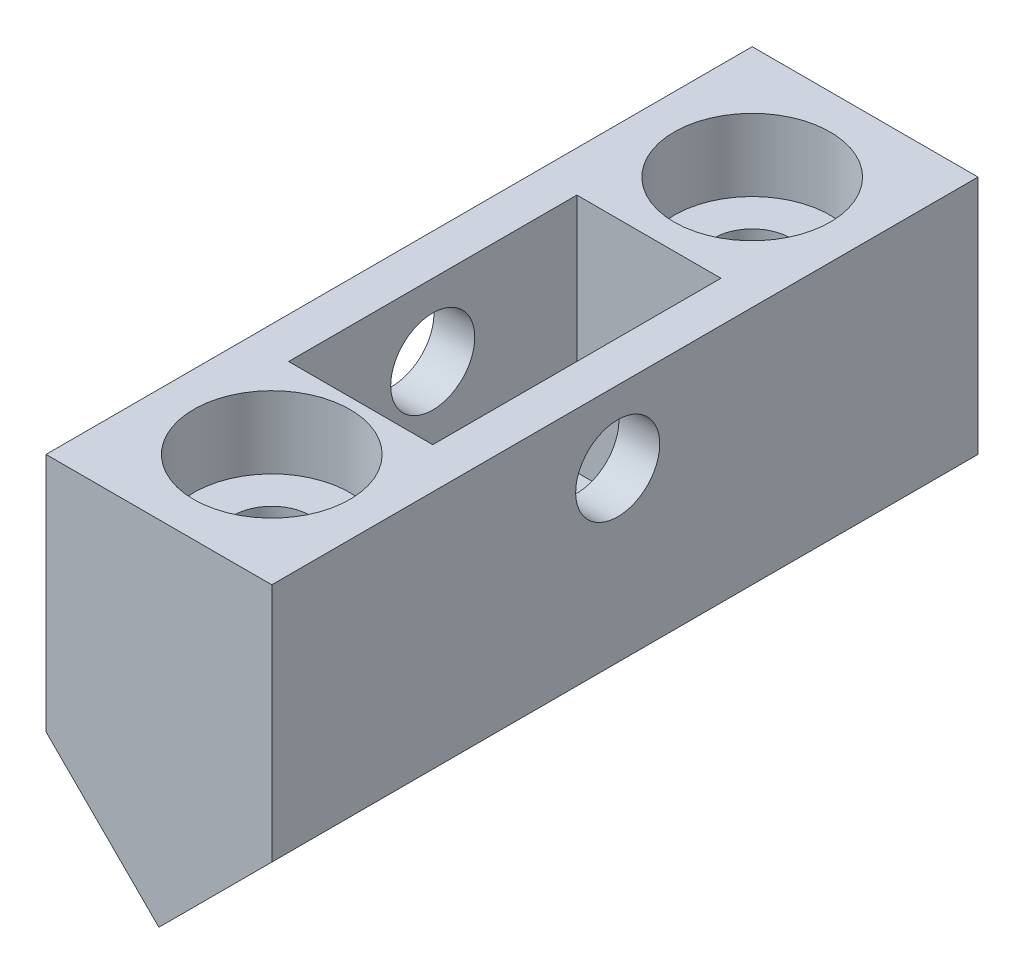
ISO-10303-21;
HEADER;
FILE_DESCRIPTION(('STEP AP214'),'2;1');
FILE_NAME('part.step','',(''),(''),'','','');
FILE_SCHEMA(('AUTOMOTIVE_DESIGN { 1 0 10303 214 1 1 1 1 }'));
ENDSEC;
DATA;
#1=APPLICATION_CONTEXT('core data for automotive mechanical design processes');
#2=APPLICATION_PROTOCOL_DEFINITION('international standard','automotive_design',2000,#1);
#3=PRODUCT_CONTEXT('',#1,'mechanical');
#4=PRODUCT('Part','Part','',(#3));
#5=PRODUCT_RELATED_PRODUCT_CATEGORY('part','',(#4));
#6=PRODUCT_DEFINITION_FORMATION('','',#4);
#7=PRODUCT_DEFINITION_CONTEXT('part definition',#1,'design');
#8=PRODUCT_DEFINITION('design','',#6,#7);
#9=PRODUCT_DEFINITION_SHAPE('','',#8);
#10=(LENGTH_UNIT() NAMED_UNIT(*) SI_UNIT(.MILLI.,.METRE.));
#11=(NAMED_UNIT(*) PLANE_ANGLE_UNIT() SI_UNIT($,.RADIAN.));
#12=(NAMED_UNIT(*) SI_UNIT($,.STERADIAN.) SOLID_ANGLE_UNIT());
#13=UNCERTAINTY_MEASURE_WITH_UNIT(LENGTH_MEASURE(1.E-05),#10,'distance_accuracy_value','');
#14=(GEOMETRIC_REPRESENTATION_CONTEXT(3) GLOBAL_UNCERTAINTY_ASSIGNED_CONTEXT((#13)) GLOBAL_UNIT_ASSIGNED_CONTEXT((#10,
#11,#12)) REPRESENTATION_CONTEXT('',''));
#15=CARTESIAN_POINT('',(0.,0.,0.));
#16=DIRECTION('',(0.,0.,1.));
#17=DIRECTION('',(1.,0.,0.));
#18=AXIS2_PLACEMENT_3D('',#15,#16,#17);
#19=CARTESIAN_POINT('',(0.,-9.70000000000001,-15.));
#20=DIRECTION('',(0.707106781186549,-0.707106781186546,0.));
#21=DIRECTION('',(0.707106781186546,0.707106781186549,0.));
#22=AXIS2_PLACEMENT_3D('',#19,#20,#21);
#23=PLANE('',#22);
#24=CARTESIAN_POINT('',(0.,-9.70000000000001,9.7));
#25=DIRECTION('',(0.707106781186549,-0.707106781186546,0.));
#26=DIRECTION('',(0.707106781186546,0.707106781186549,0.));
#27=AXIS2_PLACEMENT_3D('',#24,#25,#26);
#28=ELLIPSE('',#27,2.26274169979695,1.6);
#29=CARTESIAN_POINT('',(0.,-9.70000000000001,8.1));
#30=VERTEX_POINT('',#29);
#31=CARTESIAN_POINT('',(0.,-9.70000000000001,11.3));
#32=VERTEX_POINT('',#31);
#33=EDGE_CURVE('E45',#30,#32,#28,.T.);
#34=ORIENTED_EDGE('',*,*,#33,.F.);
#35=DIRECTION('',(0.,0.,1.));
#36=VECTOR('',#35,1.);
#37=CARTESIAN_POINT('',(0.,-9.70000000000001,-15.));
#38=LINE('',#37,#36);
#39=CARTESIAN_POINT('',(0.,-9.70000000000001,-8.7));
#40=VERTEX_POINT('',#39);
#41=EDGE_CURVE('E118',#40,#30,#38,.T.);
#42=ORIENTED_EDGE('',*,*,#41,.F.);
#43=CARTESIAN_POINT('',(0.,-9.70000000000001,-10.3));
#44=DIRECTION('',(0.707106781186549,-0.707106781186546,0.));
#45=DIRECTION('',(0.707106781186546,0.707106781186549,0.));
#46=AXIS2_PLACEMENT_3D('',#43,#44,#45);
#47=ELLIPSE('',#46,2.26274169979695,1.6);
#48=CARTESIAN_POINT('',(0.,-9.70000000000001,-11.9));
#49=VERTEX_POINT('',#48);
#50=EDGE_CURVE('E40',#49,#40,#47,.T.);
#51=ORIENTED_EDGE('',*,*,#50,.F.);
#52=CARTESIAN_POINT('',(0.,-9.70000000000001,-15.));
#53=VERTEX_POINT('',#52);
#54=EDGE_CURVE('E126',#53,#49,#38,.T.);
#55=ORIENTED_EDGE('',*,*,#54,.F.);
#56=DIRECTION('',(0.707106781186546,0.707106781186549,0.));
#57=VECTOR('',#56,1.);
#58=CARTESIAN_POINT('',(0.,-9.70000000000001,-15.));
#59=LINE('',#58,#57);
#60=CARTESIAN_POINT('',(4.7,-5.,-15.));
#61=VERTEX_POINT('',#60);
#62=EDGE_CURVE('E163',#53,#61,#59,.T.);
#63=ORIENTED_EDGE('',*,*,#62,.T.);
#64=DIRECTION('',(0.,0.,1.));
#65=VECTOR('',#64,1.);
#66=CARTESIAN_POINT('',(4.7,-5.,-15.));
#67=LINE('',#66,#65);
#68=CARTESIAN_POINT('',(4.7,-5.,14.4));
#69=VERTEX_POINT('',#68);
#70=EDGE_CURVE('E138',#61,#69,#67,.T.);
#71=ORIENTED_EDGE('',*,*,#70,.T.);
#72=DIRECTION('',(0.707106781186546,0.707106781186549,0.));
#73=VECTOR('',#72,1.);
#74=CARTESIAN_POINT('',(0.,-9.70000000000001,14.4));
#75=LINE('',#74,#73);
#76=CARTESIAN_POINT('',(0.,-9.70000000000001,14.4));
#77=VERTEX_POINT('',#76);
#78=EDGE_CURVE('E177',#77,#69,#75,.T.);
#79=ORIENTED_EDGE('',*,*,#78,.F.);
#80=EDGE_CURVE('E120',#32,#77,#38,.T.);
#81=ORIENTED_EDGE('',*,*,#80,.F.);
#82=EDGE_LOOP('',(#34,#42,#51,#55,#63,#71,#79,#81));
#83=FACE_BOUND('',#82,.T.);
#84=ADVANCED_FACE('F33',(#83),#23,.T.);
#85=CARTESIAN_POINT('',(-4.7,-5.,-15.));
#86=DIRECTION('',(-0.707106781186548,-0.707106781186547,0.));
#87=DIRECTION('',(0.707106781186547,-0.707106781186548,0.));
#88=AXIS2_PLACEMENT_3D('',#85,#86,#87);
#89=PLANE('',#88);
#90=CARTESIAN_POINT('',(0.,-9.70000000000001,9.7));
#91=DIRECTION('',(-0.707106781186548,-0.707106781186547,0.));
#92=DIRECTION('',(-0.707106781186547,0.707106781186548,0.));
#93=AXIS2_PLACEMENT_3D('',#90,#91,#92);
#94=ELLIPSE('',#93,2.26274169979695,1.6);
#95=EDGE_CURVE('E11',#32,#30,#94,.T.);
#96=ORIENTED_EDGE('',*,*,#95,.F.);
#97=ORIENTED_EDGE('',*,*,#80,.T.);
#98=DIRECTION('',(0.707106781186547,-0.707106781186548,0.));
#99=VECTOR('',#98,1.);
#100=CARTESIAN_POINT('',(-4.7,-5.,14.4));
#101=LINE('',#100,#99);
#102=CARTESIAN_POINT('',(-4.7,-5.,14.4));
#103=VERTEX_POINT('',#102);
#104=EDGE_CURVE('E165',#103,#77,#101,.T.);
#105=ORIENTED_EDGE('',*,*,#104,.F.);
#106=DIRECTION('',(0.,0.,1.));
#107=VECTOR('',#106,1.);
#108=CARTESIAN_POINT('',(-4.7,-5.,-15.));
#109=LINE('',#108,#107);
#110=CARTESIAN_POINT('',(-4.7,-5.,-15.));
#111=VERTEX_POINT('',#110);
#112=EDGE_CURVE('E128',#111,#103,#109,.T.);
#113=ORIENTED_EDGE('',*,*,#112,.F.);
#114=DIRECTION('',(0.707106781186547,-0.707106781186548,0.));
#115=VECTOR('',#114,1.);
#116=CARTESIAN_POINT('',(-4.7,-5.,-15.));
#117=LINE('',#116,#115);
#118=EDGE_CURVE('E131',#111,#53,#117,.T.);
#119=ORIENTED_EDGE('',*,*,#118,.T.);
#120=ORIENTED_EDGE('',*,*,#54,.T.);
#121=CARTESIAN_POINT('',(0.,-9.70000000000001,-10.3));
#122=DIRECTION('',(-0.707106781186548,-0.707106781186547,0.));
#123=DIRECTION('',(-0.707106781186547,0.707106781186548,0.));
#124=AXIS2_PLACEMENT_3D('',#121,#122,#123);
#125=ELLIPSE('',#124,2.26274169979695,1.6);
#126=EDGE_CURVE('E52',#40,#49,#125,.T.);
#127=ORIENTED_EDGE('',*,*,#126,.F.);
#128=ORIENTED_EDGE('',*,*,#41,.T.);
#129=EDGE_LOOP('',(#96,#97,#105,#113,#119,#120,#127,#128));
#130=FACE_BOUND('',#129,.T.);
#131=ADVANCED_FACE('F124',(#130),#89,.T.);
#132=CARTESIAN_POINT('',(-4.7,5.,-15.));
#133=DIRECTION('',(-1.,0.,0.));
#134=DIRECTION('',(0.,0.,1.));
#135=AXIS2_PLACEMENT_3D('',#132,#133,#134);
#136=PLANE('',#135);
#137=CARTESIAN_POINT('',(-4.7,2.,0.));
#138=DIRECTION('',(1.,0.,0.));
#139=DIRECTION('',(0.,1.,0.));
#140=AXIS2_PLACEMENT_3D('',#137,#138,#139);
#141=CIRCLE('',#140,1.75);
#142=CARTESIAN_POINT('',(-4.7,3.75,0.));
#143=VERTEX_POINT('',#142);
#144=EDGE_CURVE('E143',#143,#143,#141,.T.);
#145=ORIENTED_EDGE('',*,*,#144,.T.);
#146=EDGE_LOOP('',(#145));
#147=FACE_BOUND('',#146,.T.);
#148=ORIENTED_EDGE('',*,*,#112,.T.);
#149=DIRECTION('',(0.,-1.,0.));
#150=VECTOR('',#149,1.);
#151=CARTESIAN_POINT('',(-4.7,5.,14.4));
#152=LINE('',#151,#150);
#153=CARTESIAN_POINT('',(-4.7,5.,14.4));
#154=VERTEX_POINT('',#153);
#155=EDGE_CURVE('E168',#154,#103,#152,.T.);
#156=ORIENTED_EDGE('',*,*,#155,.F.);
#157=DIRECTION('',(0.,0.,1.));
#158=VECTOR('',#157,1.);
#159=CARTESIAN_POINT('',(-4.7,5.,-15.));
#160=LINE('',#159,#158);
#161=CARTESIAN_POINT('',(-4.7,5.,-15.));
#162=VERTEX_POINT('',#161);
#163=EDGE_CURVE('E134',#162,#154,#160,.T.);
#164=ORIENTED_EDGE('',*,*,#163,.F.);
#165=DIRECTION('',(0.,-1.,0.));
#166=VECTOR('',#165,1.);
#167=CARTESIAN_POINT('',(-4.7,5.,-15.));
#168=LINE('',#167,#166);
#169=EDGE_CURVE('E154',#162,#111,#168,.T.);
#170=ORIENTED_EDGE('',*,*,#169,.T.);
#171=EDGE_LOOP('',(#148,#156,#164,#170));
#172=FACE_BOUND('',#171,.T.);
#173=ADVANCED_FACE('F243',(#147,#172),#136,.T.);
#174=CARTESIAN_POINT('',(-4.7,5.,-15.));
#175=DIRECTION('',(0.,1.,0.));
#176=DIRECTION('',(0.,0.,1.));
#177=AXIS2_PLACEMENT_3D('',#174,#175,#176);
#178=PLANE('',#177);
#179=CARTESIAN_POINT('',(0.,5.,9.7));
#180=DIRECTION('',(0.,1.,0.));
#181=DIRECTION('',(0.,0.,1.));
#182=AXIS2_PLACEMENT_3D('',#179,#180,#181);
#183=CIRCLE('',#182,3.25);
#184=CARTESIAN_POINT('',(0.,5.,12.95));
#185=VERTEX_POINT('',#184);
#186=EDGE_CURVE('E233',#185,#185,#183,.T.);
#187=ORIENTED_EDGE('',*,*,#186,.F.);
#188=EDGE_LOOP('',(#187));
#189=FACE_BOUND('',#188,.T.);
#190=CARTESIAN_POINT('',(0.,5.,-10.3));
#191=DIRECTION('',(0.,1.,0.));
#192=DIRECTION('',(0.,0.,1.));
#193=AXIS2_PLACEMENT_3D('',#190,#191,#192);
#194=CIRCLE('',#193,3.25);
#195=CARTESIAN_POINT('',(0.,5.,-7.05));
#196=VERTEX_POINT('',#195);
#197=EDGE_CURVE('E121',#196,#196,#194,.T.);
#198=ORIENTED_EDGE('',*,*,#197,.F.);
#199=EDGE_LOOP('',(#198));
#200=FACE_BOUND('',#199,.T.);
#201=DIRECTION('',(0.,0.,-1.));
#202=VECTOR('',#201,1.);
#203=CARTESIAN_POINT('',(3.,5.,-6.));
#204=LINE('',#203,#202);
#205=CARTESIAN_POINT('',(3.,5.,6.));
#206=VERTEX_POINT('',#205);
#207=CARTESIAN_POINT('',(3.00000000000001,5.,-6.));
#208=VERTEX_POINT('',#207);
#209=EDGE_CURVE('E200',#206,#208,#204,.T.);
#210=ORIENTED_EDGE('',*,*,#209,.F.);
#211=DIRECTION('',(1.,0.,0.));
#212=VECTOR('',#211,1.);
#213=CARTESIAN_POINT('',(-3.,5.,6.));
#214=LINE('',#213,#212);
#215=CARTESIAN_POINT('',(-3.,5.,6.));
#216=VERTEX_POINT('',#215);
#217=EDGE_CURVE('E190',#216,#206,#214,.T.);
#218=ORIENTED_EDGE('',*,*,#217,.F.);
#219=DIRECTION('',(0.,0.,1.));
#220=VECTOR('',#219,1.);
#221=CARTESIAN_POINT('',(-3.,5.,-6.));
#222=LINE('',#221,#220);
#223=CARTESIAN_POINT('',(-3.,5.,-6.));
#224=VERTEX_POINT('',#223);
#225=EDGE_CURVE('E194',#224,#216,#222,.T.);
#226=ORIENTED_EDGE('',*,*,#225,.F.);
#227=DIRECTION('',(-1.,0.,0.));
#228=VECTOR('',#227,1.);
#229=CARTESIAN_POINT('',(-3.,5.,-6.));
#230=LINE('',#229,#228);
#231=EDGE_CURVE('E197',#208,#224,#230,.T.);
#232=ORIENTED_EDGE('',*,*,#231,.F.);
#233=EDGE_LOOP('',(#210,#218,#226,#232));
#234=FACE_BOUND('',#233,.T.);
#235=ORIENTED_EDGE('',*,*,#163,.T.);
#236=DIRECTION('',(-1.,0.,0.));
#237=VECTOR('',#236,1.);
#238=CARTESIAN_POINT('',(-4.7,5.,14.4));
#239=LINE('',#238,#237);
#240=CARTESIAN_POINT('',(4.7,5.,14.4));
#241=VERTEX_POINT('',#240);
#242=EDGE_CURVE('E171',#241,#154,#239,.T.);
#243=ORIENTED_EDGE('',*,*,#242,.F.);
#244=DIRECTION('',(0.,0.,1.));
#245=VECTOR('',#244,1.);
#246=CARTESIAN_POINT('',(4.7,5.,-15.));
#247=LINE('',#246,#245);
#248=CARTESIAN_POINT('',(4.7,5.,-15.));
#249=VERTEX_POINT('',#248);
#250=EDGE_CURVE('E136',#249,#241,#247,.T.);
#251=ORIENTED_EDGE('',*,*,#250,.F.);
#252=DIRECTION('',(-1.,0.,0.));
#253=VECTOR('',#252,1.);
#254=CARTESIAN_POINT('',(-4.7,5.,-15.));
#255=LINE('',#254,#253);
#256=EDGE_CURVE('E155',#249,#162,#255,.T.);
#257=ORIENTED_EDGE('',*,*,#256,.T.);
#258=EDGE_LOOP('',(#235,#243,#251,#257));
#259=FACE_BOUND('',#258,.T.);
#260=ADVANCED_FACE('F239',(#189,#200,#234,#259),#178,.T.);
#261=CARTESIAN_POINT('',(4.7,5.,-15.));
#262=DIRECTION('',(1.,0.,0.));
#263=DIRECTION('',(0.,1.,0.));
#264=AXIS2_PLACEMENT_3D('',#261,#262,#263);
#265=PLANE('',#264);
#266=CARTESIAN_POINT('',(4.7,2.,0.));
#267=DIRECTION('',(1.,0.,0.));
#268=DIRECTION('',(0.,1.,0.));
#269=AXIS2_PLACEMENT_3D('',#266,#267,#268);
#270=CIRCLE('',#269,1.75);
#271=CARTESIAN_POINT('',(4.7,3.75,0.));
#272=VERTEX_POINT('',#271);
#273=EDGE_CURVE('E214',#272,#272,#270,.T.);
#274=ORIENTED_EDGE('',*,*,#273,.F.);
#275=EDGE_LOOP('',(#274));
#276=FACE_BOUND('',#275,.T.);
#277=ORIENTED_EDGE('',*,*,#250,.T.);
#278=DIRECTION('',(0.,1.,0.));
#279=VECTOR('',#278,1.);
#280=CARTESIAN_POINT('',(4.7,5.,14.4));
#281=LINE('',#280,#279);
#282=EDGE_CURVE('E174',#69,#241,#281,.T.);
#283=ORIENTED_EDGE('',*,*,#282,.F.);
#284=ORIENTED_EDGE('',*,*,#70,.F.);
#285=DIRECTION('',(0.,1.,0.));
#286=VECTOR('',#285,1.);
#287=CARTESIAN_POINT('',(4.7,5.,-15.));
#288=LINE('',#287,#286);
#289=EDGE_CURVE('E158',#61,#249,#288,.T.);
#290=ORIENTED_EDGE('',*,*,#289,.T.);
#291=EDGE_LOOP('',(#277,#283,#284,#290));
#292=FACE_BOUND('',#291,.T.);
#293=ADVANCED_FACE('F242',(#276,#292),#265,.T.);
#294=CARTESIAN_POINT('',(0.,0.,-15.));
#295=DIRECTION('',(0.,0.,-1.));
#296=DIRECTION('',(-1.,0.,0.));
#297=AXIS2_PLACEMENT_3D('',#294,#295,#296);
#298=PLANE('',#297);
#299=ORIENTED_EDGE('',*,*,#62,.F.);
#300=ORIENTED_EDGE('',*,*,#118,.F.);
#301=ORIENTED_EDGE('',*,*,#169,.F.);
#302=ORIENTED_EDGE('',*,*,#256,.F.);
#303=ORIENTED_EDGE('',*,*,#289,.F.);
#304=EDGE_LOOP('',(#299,#300,#301,#302,#303));
#305=FACE_BOUND('',#304,.T.);
#306=ADVANCED_FACE('F370',(#305),#298,.T.);
#307=CARTESIAN_POINT('',(0.,0.,14.4));
#308=DIRECTION('',(0.,0.,-1.));
#309=DIRECTION('',(-1.,0.,0.));
#310=AXIS2_PLACEMENT_3D('',#307,#308,#309);
#311=PLANE('',#310);
#312=ORIENTED_EDGE('',*,*,#78,.T.);
#313=ORIENTED_EDGE('',*,*,#282,.T.);
#314=ORIENTED_EDGE('',*,*,#242,.T.);
#315=ORIENTED_EDGE('',*,*,#155,.T.);
#316=ORIENTED_EDGE('',*,*,#104,.T.);
#317=EDGE_LOOP('',(#312,#313,#314,#315,#316));
#318=FACE_BOUND('',#317,.T.);
#319=ADVANCED_FACE('F255',(#318),#311,.F.);
#320=CARTESIAN_POINT('',(3.00000000000001,-5.,-6.));
#321=DIRECTION('',(1.,0.,0.));
#322=DIRECTION('',(0.,1.,0.));
#323=AXIS2_PLACEMENT_3D('',#320,#321,#322);
#324=PLANE('',#323);
#325=CARTESIAN_POINT('',(3.,2.,0.));
#326=DIRECTION('',(1.,0.,0.));
#327=DIRECTION('',(0.,1.,0.));
#328=AXIS2_PLACEMENT_3D('',#325,#326,#327);
#329=CIRCLE('',#328,1.75);
#330=CARTESIAN_POINT('',(3.,3.75,0.));
#331=VERTEX_POINT('',#330);
#332=EDGE_CURVE('E142',#331,#331,#329,.T.);
#333=ORIENTED_EDGE('',*,*,#332,.T.);
#334=EDGE_LOOP('',(#333));
#335=FACE_BOUND('',#334,.T.);
#336=ORIENTED_EDGE('',*,*,#209,.T.);
#337=DIRECTION('',(0.,1.,0.));
#338=VECTOR('',#337,1.);
#339=CARTESIAN_POINT('',(3.00000000000001,-5.,-6.));
#340=LINE('',#339,#338);
#341=CARTESIAN_POINT('',(3.00000000000001,-5.,-6.));
#342=VERTEX_POINT('',#341);
#343=EDGE_CURVE('E181',#342,#208,#340,.T.);
#344=ORIENTED_EDGE('',*,*,#343,.F.);
#345=DIRECTION('',(0.,0.,-1.));
#346=VECTOR('',#345,1.);
#347=CARTESIAN_POINT('',(3.00000000000001,-5.,-6.));
#348=LINE('',#347,#346);
#349=CARTESIAN_POINT('',(3.00000000000001,-5.,6.));
#350=VERTEX_POINT('',#349);
#351=EDGE_CURVE('E193',#350,#342,#348,.T.);
#352=ORIENTED_EDGE('',*,*,#351,.F.);
#353=DIRECTION('',(0.,1.,0.));
#354=VECTOR('',#353,1.);
#355=CARTESIAN_POINT('',(3.00000000000001,-5.,6.));
#356=LINE('',#355,#354);
#357=EDGE_CURVE('E180',#350,#206,#356,.T.);
#358=ORIENTED_EDGE('',*,*,#357,.T.);
#359=EDGE_LOOP('',(#336,#344,#352,#358));
#360=FACE_BOUND('',#359,.T.);
#361=ADVANCED_FACE('F357',(#335,#360),#324,.F.);
#362=CARTESIAN_POINT('',(-2.99999999999999,-5.,6.));
#363=DIRECTION('',(0.,0.,1.));
#364=DIRECTION('',(1.,0.,0.));
#365=AXIS2_PLACEMENT_3D('',#362,#363,#364);
#366=PLANE('',#365);
#367=ORIENTED_EDGE('',*,*,#217,.T.);
#368=ORIENTED_EDGE('',*,*,#357,.F.);
#369=DIRECTION('',(1.,0.,0.));
#370=VECTOR('',#369,1.);
#371=CARTESIAN_POINT('',(-2.99999999999999,-5.,6.));
#372=LINE('',#371,#370);
#373=CARTESIAN_POINT('',(-2.99999999999999,-5.,6.));
#374=VERTEX_POINT('',#373);
#375=EDGE_CURVE('E185',#374,#350,#372,.T.);
#376=ORIENTED_EDGE('',*,*,#375,.F.);
#377=DIRECTION('',(0.,1.,0.));
#378=VECTOR('',#377,1.);
#379=CARTESIAN_POINT('',(-2.99999999999999,-5.,6.));
#380=LINE('',#379,#378);
#381=EDGE_CURVE('E187',#374,#216,#380,.T.);
#382=ORIENTED_EDGE('',*,*,#381,.T.);
#383=EDGE_LOOP('',(#367,#368,#376,#382));
#384=FACE_BOUND('',#383,.T.);
#385=ADVANCED_FACE('F353',(#384),#366,.F.);
#386=CARTESIAN_POINT('',(-2.99999999999999,-5.,-6.));
#387=DIRECTION('',(-1.,0.,0.));
#388=DIRECTION('',(0.,-1.,0.));
#389=AXIS2_PLACEMENT_3D('',#386,#387,#388);
#390=PLANE('',#389);
#391=CARTESIAN_POINT('',(-3.,2.,0.));
#392=DIRECTION('',(-1.,0.,0.));
#393=DIRECTION('',(0.,-1.,0.));
#394=AXIS2_PLACEMENT_3D('',#391,#392,#393);
#395=CIRCLE('',#394,1.75);
#396=CARTESIAN_POINT('',(-3.,0.250000000000002,0.));
#397=VERTEX_POINT('',#396);
#398=EDGE_CURVE('E140',#397,#397,#395,.T.);
#399=ORIENTED_EDGE('',*,*,#398,.T.);
#400=EDGE_LOOP('',(#399));
#401=FACE_BOUND('',#400,.T.);
#402=ORIENTED_EDGE('',*,*,#225,.T.);
#403=ORIENTED_EDGE('',*,*,#381,.F.);
#404=DIRECTION('',(0.,0.,1.));
#405=VECTOR('',#404,1.);
#406=CARTESIAN_POINT('',(-2.99999999999999,-5.,-6.));
#407=LINE('',#406,#405);
#408=CARTESIAN_POINT('',(-2.99999999999999,-5.,-6.));
#409=VERTEX_POINT('',#408);
#410=EDGE_CURVE('E204',#409,#374,#407,.T.);
#411=ORIENTED_EDGE('',*,*,#410,.F.);
#412=DIRECTION('',(0.,1.,0.));
#413=VECTOR('',#412,1.);
#414=CARTESIAN_POINT('',(-2.99999999999999,-5.,-6.));
#415=LINE('',#414,#413);
#416=EDGE_CURVE('E184',#409,#224,#415,.T.);
#417=ORIENTED_EDGE('',*,*,#416,.T.);
#418=EDGE_LOOP('',(#402,#403,#411,#417));
#419=FACE_BOUND('',#418,.T.);
#420=ADVANCED_FACE('F356',(#401,#419),#390,.F.);
#421=CARTESIAN_POINT('',(-2.99999999999999,-5.,-6.));
#422=DIRECTION('',(0.,0.,-1.));
#423=DIRECTION('',(-1.,0.,0.));
#424=AXIS2_PLACEMENT_3D('',#421,#422,#423);
#425=PLANE('',#424);
#426=ORIENTED_EDGE('',*,*,#231,.T.);
#427=ORIENTED_EDGE('',*,*,#416,.F.);
#428=DIRECTION('',(-1.,0.,0.));
#429=VECTOR('',#428,1.);
#430=CARTESIAN_POINT('',(-2.99999999999999,-5.,-6.));
#431=LINE('',#430,#429);
#432=EDGE_CURVE('E207',#342,#409,#431,.T.);
#433=ORIENTED_EDGE('',*,*,#432,.F.);
#434=ORIENTED_EDGE('',*,*,#343,.T.);
#435=EDGE_LOOP('',(#426,#427,#433,#434));
#436=FACE_BOUND('',#435,.T.);
#437=ADVANCED_FACE('F351',(#436),#425,.F.);
#438=CARTESIAN_POINT('',(0.,-5.,0.));
#439=DIRECTION('',(0.,1.,0.));
#440=DIRECTION('',(-1.,0.,0.));
#441=AXIS2_PLACEMENT_3D('',#438,#439,#440);
#442=PLANE('',#441);
#443=ORIENTED_EDGE('',*,*,#351,.T.);
#444=ORIENTED_EDGE('',*,*,#432,.T.);
#445=ORIENTED_EDGE('',*,*,#410,.T.);
#446=ORIENTED_EDGE('',*,*,#375,.T.);
#447=EDGE_LOOP('',(#443,#444,#445,#446));
#448=FACE_BOUND('',#447,.T.);
#449=ADVANCED_FACE('F348',(#448),#442,.T.);
#450=CARTESIAN_POINT('',(-4.7,2.,0.));
#451=DIRECTION('',(1.,0.,0.));
#452=DIRECTION('',(0.,1.,0.));
#453=AXIS2_PLACEMENT_3D('',#450,#451,#452);
#454=CYLINDRICAL_SURFACE('',#453,1.75);
#455=ORIENTED_EDGE('',*,*,#144,.F.);
#456=EDGE_LOOP('',(#455));
#457=FACE_BOUND('',#456,.T.);
#458=ORIENTED_EDGE('',*,*,#398,.F.);
#459=EDGE_LOOP('',(#458));
#460=FACE_BOUND('',#459,.T.);
#461=ADVANCED_FACE('F346',(#457,#460),#454,.F.);
#462=ORIENTED_EDGE('',*,*,#273,.T.);
#463=EDGE_LOOP('',(#462));
#464=FACE_BOUND('',#463,.T.);
#465=ORIENTED_EDGE('',*,*,#332,.F.);
#466=EDGE_LOOP('',(#465));
#467=FACE_BOUND('',#466,.T.);
#468=ADVANCED_FACE('F291',(#464,#467),#454,.F.);
#469=CARTESIAN_POINT('',(0.,5.,-10.3));
#470=DIRECTION('',(0.,1.,0.));
#471=DIRECTION('',(0.,0.,1.));
#472=AXIS2_PLACEMENT_3D('',#469,#470,#471);
#473=CYLINDRICAL_SURFACE('',#472,1.6);
#474=ORIENTED_EDGE('',*,*,#126,.T.);
#475=ORIENTED_EDGE('',*,*,#50,.T.);
#476=EDGE_LOOP('',(#474,#475));
#477=FACE_BOUND('',#476,.T.);
#478=CARTESIAN_POINT('',(0.,2.,-10.3));
#479=DIRECTION('',(0.,1.,0.));
#480=DIRECTION('',(0.,0.,1.));
#481=AXIS2_PLACEMENT_3D('',#478,#479,#480);
#482=CIRCLE('',#481,1.6);
#483=CARTESIAN_POINT('',(0.,2.,-8.7));
#484=VERTEX_POINT('',#483);
#485=EDGE_CURVE('E220',#484,#484,#482,.T.);
#486=ORIENTED_EDGE('',*,*,#485,.T.);
#487=EDGE_LOOP('',(#486));
#488=FACE_BOUND('',#487,.T.);
#489=ADVANCED_FACE('F144',(#477,#488),#473,.F.);
#490=CARTESIAN_POINT('',(1.6,2.,-10.3));
#491=DIRECTION('',(0.,-1.,0.));
#492=DIRECTION('',(0.,0.,-1.));
#493=AXIS2_PLACEMENT_3D('',#490,#491,#492);
#494=PLANE('',#493);
#495=ORIENTED_EDGE('',*,*,#485,.F.);
#496=EDGE_LOOP('',(#495));
#497=FACE_BOUND('',#496,.T.);
#498=CARTESIAN_POINT('',(0.,2.,-10.3));
#499=DIRECTION('',(0.,1.,0.));
#500=DIRECTION('',(0.,0.,1.));
#501=AXIS2_PLACEMENT_3D('',#498,#499,#500);
#502=CIRCLE('',#501,3.25);
#503=CARTESIAN_POINT('',(0.,2.,-7.05));
#504=VERTEX_POINT('',#503);
#505=EDGE_CURVE('E223',#504,#504,#502,.T.);
#506=ORIENTED_EDGE('',*,*,#505,.T.);
#507=EDGE_LOOP('',(#506));
#508=FACE_BOUND('',#507,.T.);
#509=ADVANCED_FACE('F290',(#497,#508),#494,.F.);
#510=CARTESIAN_POINT('',(0.,5.,-10.3));
#511=DIRECTION('',(0.,1.,0.));
#512=DIRECTION('',(0.,0.,1.));
#513=AXIS2_PLACEMENT_3D('',#510,#511,#512);
#514=CYLINDRICAL_SURFACE('',#513,3.25);
#515=ORIENTED_EDGE('',*,*,#505,.F.);
#516=EDGE_LOOP('',(#515));
#517=FACE_BOUND('',#516,.T.);
#518=ORIENTED_EDGE('',*,*,#197,.T.);
#519=EDGE_LOOP('',(#518));
#520=FACE_BOUND('',#519,.T.);
#521=ADVANCED_FACE('F302',(#517,#520),#514,.F.);
#522=CARTESIAN_POINT('',(0.,5.,9.7));
#523=DIRECTION('',(0.,1.,0.));
#524=DIRECTION('',(0.,0.,1.));
#525=AXIS2_PLACEMENT_3D('',#522,#523,#524);
#526=CYLINDRICAL_SURFACE('',#525,1.6);
#527=ORIENTED_EDGE('',*,*,#33,.T.);
#528=ORIENTED_EDGE('',*,*,#95,.T.);
#529=EDGE_LOOP('',(#527,#528));
#530=FACE_BOUND('',#529,.T.);
#531=CARTESIAN_POINT('',(0.,2.,9.7));
#532=DIRECTION('',(0.,1.,0.));
#533=DIRECTION('',(0.,0.,1.));
#534=AXIS2_PLACEMENT_3D('',#531,#532,#533);
#535=CIRCLE('',#534,1.6);
#536=CARTESIAN_POINT('',(0.,2.,11.3));
#537=VERTEX_POINT('',#536);
#538=EDGE_CURVE('E122',#537,#537,#535,.T.);
#539=ORIENTED_EDGE('',*,*,#538,.T.);
#540=EDGE_LOOP('',(#539));
#541=FACE_BOUND('',#540,.T.);
#542=ADVANCED_FACE('F111',(#530,#541),#526,.F.);
#543=CARTESIAN_POINT('',(1.6,2.,9.7));
#544=DIRECTION('',(0.,-1.,0.));
#545=DIRECTION('',(0.,0.,-1.));
#546=AXIS2_PLACEMENT_3D('',#543,#544,#545);
#547=PLANE('',#546);
#548=ORIENTED_EDGE('',*,*,#538,.F.);
#549=EDGE_LOOP('',(#548));
#550=FACE_BOUND('',#549,.T.);
#551=CARTESIAN_POINT('',(0.,2.,9.7));
#552=DIRECTION('',(0.,1.,0.));
#553=DIRECTION('',(0.,0.,1.));
#554=AXIS2_PLACEMENT_3D('',#551,#552,#553);
#555=CIRCLE('',#554,3.25);
#556=CARTESIAN_POINT('',(0.,2.,12.95));
#557=VERTEX_POINT('',#556);
#558=EDGE_CURVE('E230',#557,#557,#555,.T.);
#559=ORIENTED_EDGE('',*,*,#558,.T.);
#560=EDGE_LOOP('',(#559));
#561=FACE_BOUND('',#560,.T.);
#562=ADVANCED_FACE('F321',(#550,#561),#547,.F.);
#563=CARTESIAN_POINT('',(0.,5.,9.7));
#564=DIRECTION('',(0.,1.,0.));
#565=DIRECTION('',(0.,0.,1.));
#566=AXIS2_PLACEMENT_3D('',#563,#564,#565);
#567=CYLINDRICAL_SURFACE('',#566,3.25);
#568=ORIENTED_EDGE('',*,*,#558,.F.);
#569=EDGE_LOOP('',(#568));
#570=FACE_BOUND('',#569,.T.);
#571=ORIENTED_EDGE('',*,*,#186,.T.);
#572=EDGE_LOOP('',(#571));
#573=FACE_BOUND('',#572,.T.);
#574=ADVANCED_FACE('F237',(#570,#573),#567,.F.);
#575=CLOSED_SHELL('',(#84,#131,#173,#260,#293,#306,#319,#361,#385,#420,#437,#449,#461,#468,#489,
#509,#521,#542,#562,#574));
#576=MANIFOLD_SOLID_BREP('B2',#575);
#577=ADVANCED_BREP_SHAPE_REPRESENTATION('',(#18,#576),#14);
#578=SHAPE_DEFINITION_REPRESENTATION(#9,#577);
ENDSEC;
END-ISO-10303-21;
